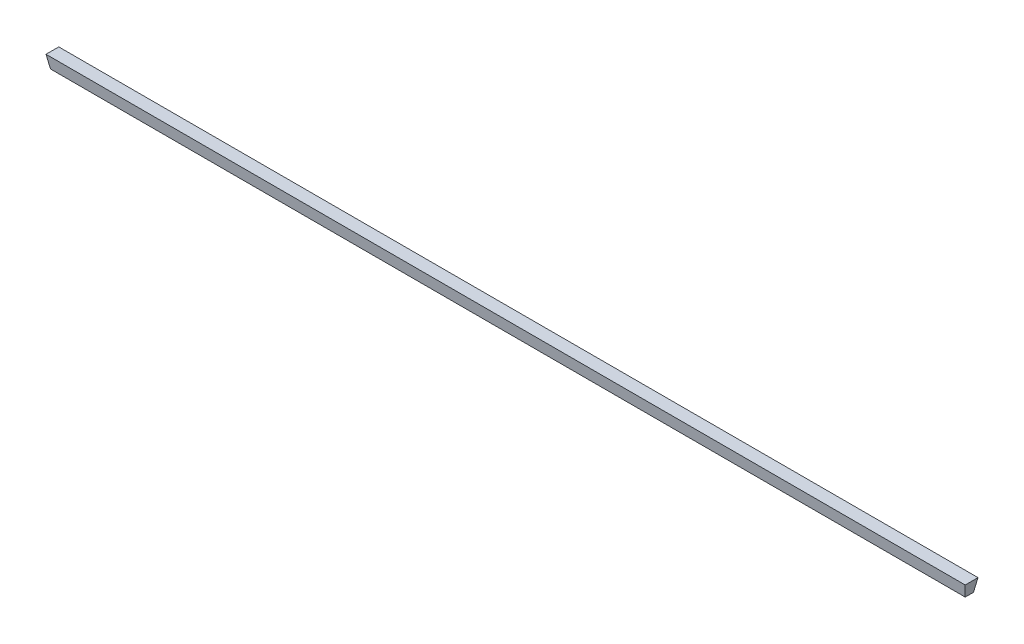
ISO-10303-21;
HEADER;
FILE_DESCRIPTION(('STEP AP214'),'2;1');
FILE_NAME('part.step','',(''),(''),'','','');
FILE_SCHEMA(('AUTOMOTIVE_DESIGN { 1 0 10303 214 1 1 1 1 }'));
ENDSEC;
DATA;
#1=APPLICATION_CONTEXT('core data for automotive mechanical design processes');
#2=APPLICATION_PROTOCOL_DEFINITION('international standard','automotive_design',2000,#1);
#3=PRODUCT_CONTEXT('',#1,'mechanical');
#4=PRODUCT('Part','Part','',(#3));
#5=PRODUCT_RELATED_PRODUCT_CATEGORY('part','',(#4));
#6=PRODUCT_DEFINITION_FORMATION('','',#4);
#7=PRODUCT_DEFINITION_CONTEXT('part definition',#1,'design');
#8=PRODUCT_DEFINITION('design','',#6,#7);
#9=PRODUCT_DEFINITION_SHAPE('','',#8);
#10=(LENGTH_UNIT() NAMED_UNIT(*) SI_UNIT(.MILLI.,.METRE.));
#11=(NAMED_UNIT(*) PLANE_ANGLE_UNIT() SI_UNIT($,.RADIAN.));
#12=(NAMED_UNIT(*) SI_UNIT($,.STERADIAN.) SOLID_ANGLE_UNIT());
#13=UNCERTAINTY_MEASURE_WITH_UNIT(LENGTH_MEASURE(1.E-05),#10,'distance_accuracy_value','');
#14=(GEOMETRIC_REPRESENTATION_CONTEXT(3) GLOBAL_UNCERTAINTY_ASSIGNED_CONTEXT((#13)) GLOBAL_UNIT_ASSIGNED_CONTEXT((#10,
#11,#12)) REPRESENTATION_CONTEXT('',''));
#15=CARTESIAN_POINT('',(0.,0.,0.));
#16=DIRECTION('',(0.,0.,1.));
#17=DIRECTION('',(1.,0.,0.));
#18=AXIS2_PLACEMENT_3D('',#15,#16,#17);
#19=CARTESIAN_POINT('',(1828.8,0.,-25.4));
#20=DIRECTION('',(0.984807753012208,-0.17364817766693,0.));
#21=DIRECTION('',(0.17364817766693,0.984807753012208,0.));
#22=AXIS2_PLACEMENT_3D('',#19,#20,#21);
#23=PLANE('',#22);
#24=DIRECTION('',(0.,0.,-1.));
#25=VECTOR('',#24,1.);
#26=CARTESIAN_POINT('',(1828.8,0.,-25.4));
#27=LINE('',#26,#25);
#28=CARTESIAN_POINT('',(1828.8,0.,25.4));
#29=VERTEX_POINT('',#28);
#30=CARTESIAN_POINT('',(1828.8,0.,-25.4));
#31=VERTEX_POINT('',#30);
#32=EDGE_CURVE('E96',#29,#31,#27,.T.);
#33=ORIENTED_EDGE('',*,*,#32,.F.);
#34=DIRECTION('',(0.171087869746036,0.970287525247814,0.171087869746036));
#35=VECTOR('',#34,1.);
#36=CARTESIAN_POINT('',(1721.73817396431,-607.177787571266,-81.6618260356871));
#37=LINE('',#36,#35);
#38=CARTESIAN_POINT('',(1819.84258938001,-50.8,16.44258938001));
#39=VERTEX_POINT('',#38);
#40=EDGE_CURVE('E11',#39,#29,#37,.T.);
#41=ORIENTED_EDGE('',*,*,#40,.F.);
#42=DIRECTION('',(0.,0.,-1.));
#43=VECTOR('',#42,1.);
#44=CARTESIAN_POINT('',(1819.84258938001,-50.8,0.));
#45=LINE('',#44,#43);
#46=CARTESIAN_POINT('',(1819.84258938001,-50.8,-16.44258938001));
#47=VERTEX_POINT('',#46);
#48=EDGE_CURVE('E98',#39,#47,#45,.T.);
#49=ORIENTED_EDGE('',*,*,#48,.T.);
#50=DIRECTION('',(0.171087869746036,0.970287525247814,-0.171087869746036));
#51=VECTOR('',#50,1.);
#52=CARTESIAN_POINT('',(1828.8,0.,-25.4));
#53=LINE('',#52,#51);
#54=EDGE_CURVE('E83',#47,#31,#53,.T.);
#55=ORIENTED_EDGE('',*,*,#54,.T.);
#56=EDGE_LOOP('',(#33,#41,#49,#55));
#57=FACE_BOUND('',#56,.T.);
#58=ADVANCED_FACE('F45',(#57),#23,.T.);
#59=CARTESIAN_POINT('',(-1828.8,0.,25.4));
#60=DIRECTION('',(0.,-0.17364817766693,0.984807753012208));
#61=DIRECTION('',(0.,-0.984807753012208,-0.17364817766693));
#62=AXIS2_PLACEMENT_3D('',#59,#60,#61);
#63=PLANE('',#62);
#64=DIRECTION('',(1.,0.,0.));
#65=VECTOR('',#64,1.);
#66=CARTESIAN_POINT('',(-1828.8,0.,25.4));
#67=LINE('',#66,#65);
#68=CARTESIAN_POINT('',(-1828.8,0.,25.4));
#69=VERTEX_POINT('',#68);
#70=EDGE_CURVE('E110',#69,#29,#67,.T.);
#71=ORIENTED_EDGE('',*,*,#70,.F.);
#72=DIRECTION('',(-0.171087869746036,0.970287525247814,0.171087869746036));
#73=VECTOR('',#72,1.);
#74=CARTESIAN_POINT('',(-1827.31303019395,-8.4330248273787,23.9130301939488));
#75=LINE('',#74,#73);
#76=CARTESIAN_POINT('',(-1819.84258938001,-50.8,16.44258938001));
#77=VERTEX_POINT('',#76);
#78=EDGE_CURVE('E56',#77,#69,#75,.T.);
#79=ORIENTED_EDGE('',*,*,#78,.F.);
#80=DIRECTION('',(1.,0.,0.));
#81=VECTOR('',#80,1.);
#82=CARTESIAN_POINT('',(0.,-50.8,16.44258938001));
#83=LINE('',#82,#81);
#84=EDGE_CURVE('E100',#77,#39,#83,.T.);
#85=ORIENTED_EDGE('',*,*,#84,.T.);
#86=ORIENTED_EDGE('',*,*,#40,.T.);
#87=EDGE_LOOP('',(#71,#79,#85,#86));
#88=FACE_BOUND('',#87,.T.);
#89=ADVANCED_FACE('F47',(#88),#63,.T.);
#90=CARTESIAN_POINT('',(-1828.8,0.,-25.4));
#91=DIRECTION('',(-0.984807753012208,-0.17364817766693,0.));
#92=DIRECTION('',(0.17364817766693,-0.984807753012208,0.));
#93=AXIS2_PLACEMENT_3D('',#90,#91,#92);
#94=PLANE('',#93);
#95=DIRECTION('',(0.,0.,1.));
#96=VECTOR('',#95,1.);
#97=CARTESIAN_POINT('',(-1828.8,0.,-25.4));
#98=LINE('',#97,#96);
#99=CARTESIAN_POINT('',(-1828.8,0.,-25.4));
#100=VERTEX_POINT('',#99);
#101=EDGE_CURVE('E107',#100,#69,#98,.T.);
#102=ORIENTED_EDGE('',*,*,#101,.F.);
#103=DIRECTION('',(-0.171087869746036,0.970287525247814,-0.171087869746036));
#104=VECTOR('',#103,1.);
#105=CARTESIAN_POINT('',(-1828.8,0.,-25.4));
#106=LINE('',#105,#104);
#107=CARTESIAN_POINT('',(-1819.84258938001,-50.8,-16.44258938001));
#108=VERTEX_POINT('',#107);
#109=EDGE_CURVE('E76',#108,#100,#106,.T.);
#110=ORIENTED_EDGE('',*,*,#109,.F.);
#111=DIRECTION('',(0.,0.,1.));
#112=VECTOR('',#111,1.);
#113=CARTESIAN_POINT('',(-1819.84258938001,-50.8,0.));
#114=LINE('',#113,#112);
#115=EDGE_CURVE('E125',#108,#77,#114,.T.);
#116=ORIENTED_EDGE('',*,*,#115,.T.);
#117=ORIENTED_EDGE('',*,*,#78,.T.);
#118=EDGE_LOOP('',(#102,#110,#116,#117));
#119=FACE_BOUND('',#118,.T.);
#120=ADVANCED_FACE('F132',(#119),#94,.T.);
#121=CARTESIAN_POINT('',(-1828.8,0.,-25.4));
#122=DIRECTION('',(0.,-0.17364817766693,-0.984807753012208));
#123=DIRECTION('',(0.,0.984807753012208,-0.17364817766693));
#124=AXIS2_PLACEMENT_3D('',#121,#122,#123);
#125=PLANE('',#124);
#126=DIRECTION('',(-1.,0.,0.));
#127=VECTOR('',#126,1.);
#128=CARTESIAN_POINT('',(-1828.8,0.,-25.4));
#129=LINE('',#128,#127);
#130=EDGE_CURVE('E103',#31,#100,#129,.T.);
#131=ORIENTED_EDGE('',*,*,#130,.F.);
#132=ORIENTED_EDGE('',*,*,#54,.F.);
#133=DIRECTION('',(-1.,0.,0.));
#134=VECTOR('',#133,1.);
#135=CARTESIAN_POINT('',(0.,-50.8,-16.44258938001));
#136=LINE('',#135,#134);
#137=EDGE_CURVE('E49',#47,#108,#136,.T.);
#138=ORIENTED_EDGE('',*,*,#137,.T.);
#139=ORIENTED_EDGE('',*,*,#109,.T.);
#140=EDGE_LOOP('',(#131,#132,#138,#139));
#141=FACE_BOUND('',#140,.T.);
#142=ADVANCED_FACE('F104',(#141),#125,.T.);
#143=CARTESIAN_POINT('',(0.,-50.8,0.));
#144=DIRECTION('',(0.,1.,0.));
#145=DIRECTION('',(0.,0.,1.));
#146=AXIS2_PLACEMENT_3D('',#143,#144,#145);
#147=PLANE('',#146);
#148=ORIENTED_EDGE('',*,*,#48,.F.);
#149=ORIENTED_EDGE('',*,*,#84,.F.);
#150=ORIENTED_EDGE('',*,*,#115,.F.);
#151=ORIENTED_EDGE('',*,*,#137,.F.);
#152=EDGE_LOOP('',(#148,#149,#150,#151));
#153=FACE_BOUND('',#152,.T.);
#154=ADVANCED_FACE('F130',(#153),#147,.F.);
#155=CARTESIAN_POINT('',(0.,0.,0.));
#156=DIRECTION('',(0.,1.,0.));
#157=DIRECTION('',(0.,0.,1.));
#158=AXIS2_PLACEMENT_3D('',#155,#156,#157);
#159=PLANE('',#158);
#160=ORIENTED_EDGE('',*,*,#32,.T.);
#161=ORIENTED_EDGE('',*,*,#130,.T.);
#162=ORIENTED_EDGE('',*,*,#101,.T.);
#163=ORIENTED_EDGE('',*,*,#70,.T.);
#164=EDGE_LOOP('',(#160,#161,#162,#163));
#165=FACE_BOUND('',#164,.T.);
#166=ADVANCED_FACE('F109',(#165),#159,.T.);
#167=CLOSED_SHELL('',(#58,#89,#120,#142,#154,#166));
#168=MANIFOLD_SOLID_BREP('B2',#167);
#169=ADVANCED_BREP_SHAPE_REPRESENTATION('',(#18,#168),#14);
#170=SHAPE_DEFINITION_REPRESENTATION(#9,#169);
ENDSEC;
END-ISO-10303-21;
